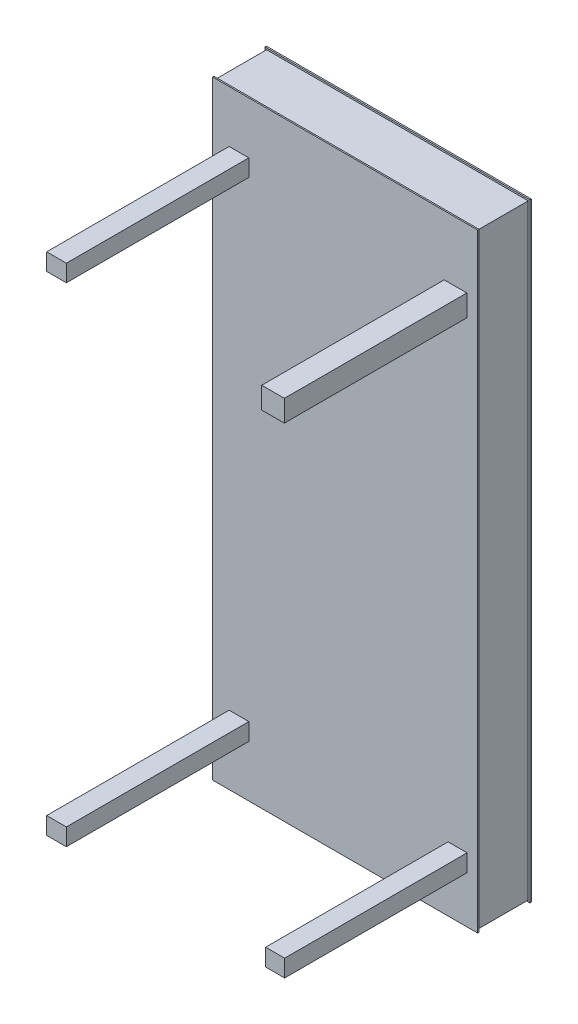
ISO-10303-21;
HEADER;
FILE_DESCRIPTION(('STEP AP214'),'2;1');
FILE_NAME('part.step','',(''),(''),'','','');
FILE_SCHEMA(('AUTOMOTIVE_DESIGN { 1 0 10303 214 1 1 1 1 }'));
ENDSEC;
DATA;
#1=APPLICATION_CONTEXT('core data for automotive mechanical design processes');
#2=APPLICATION_PROTOCOL_DEFINITION('international standard','automotive_design',2000,#1);
#3=PRODUCT_CONTEXT('',#1,'mechanical');
#4=PRODUCT('Part','Part','',(#3));
#5=PRODUCT_RELATED_PRODUCT_CATEGORY('part','',(#4));
#6=PRODUCT_DEFINITION_FORMATION('','',#4);
#7=PRODUCT_DEFINITION_CONTEXT('part definition',#1,'design');
#8=PRODUCT_DEFINITION('design','',#6,#7);
#9=PRODUCT_DEFINITION_SHAPE('','',#8);
#10=(LENGTH_UNIT() NAMED_UNIT(*) SI_UNIT(.MILLI.,.METRE.));
#11=(NAMED_UNIT(*) PLANE_ANGLE_UNIT() SI_UNIT($,.RADIAN.));
#12=(NAMED_UNIT(*) SI_UNIT($,.STERADIAN.) SOLID_ANGLE_UNIT());
#13=UNCERTAINTY_MEASURE_WITH_UNIT(LENGTH_MEASURE(1.E-05),#10,'distance_accuracy_value','');
#14=(GEOMETRIC_REPRESENTATION_CONTEXT(3) GLOBAL_UNCERTAINTY_ASSIGNED_CONTEXT((#13)) GLOBAL_UNIT_ASSIGNED_CONTEXT((#10,
#11,#12)) REPRESENTATION_CONTEXT('',''));
#15=CARTESIAN_POINT('',(0.,0.,0.));
#16=DIRECTION('',(0.,0.,1.));
#17=DIRECTION('',(1.,0.,0.));
#18=AXIS2_PLACEMENT_3D('',#15,#16,#17);
#19=CARTESIAN_POINT('',(304.974394134603,336.55533738051,50.8));
#20=DIRECTION('',(1.,0.,0.));
#21=DIRECTION('',(0.,1.,0.));
#22=AXIS2_PLACEMENT_3D('',#19,#20,#21);
#23=PLANE('',#22);
#24=DIRECTION('',(0.,0.,-1.));
#25=VECTOR('',#24,1.);
#26=CARTESIAN_POINT('',(304.974394134603,-1024.43660351407,50.8));
#27=LINE('',#26,#25);
#28=CARTESIAN_POINT('',(304.974394134603,-1024.43660351407,127.));
#29=VERTEX_POINT('',#28);
#30=CARTESIAN_POINT('',(304.974394134603,-1024.43660351407,123.892156102237));
#31=VERTEX_POINT('',#30);
#32=EDGE_CURVE('E339',#29,#31,#27,.T.);
#33=ORIENTED_EDGE('',*,*,#32,.T.);
#34=DIRECTION('',(0.,-1.,0.));
#35=VECTOR('',#34,1.);
#36=CARTESIAN_POINT('',(304.974394134603,416.55533738051,123.892156102237));
#37=LINE('',#36,#35);
#38=CARTESIAN_POINT('',(304.974394134603,416.55533738051,123.892156102237));
#39=VERTEX_POINT('',#38);
#40=EDGE_CURVE('E282',#39,#31,#37,.T.);
#41=ORIENTED_EDGE('',*,*,#40,.F.);
#42=DIRECTION('',(0.,0.,-1.));
#43=VECTOR('',#42,1.);
#44=CARTESIAN_POINT('',(304.974394134603,416.55533738051,50.8));
#45=LINE('',#44,#43);
#46=CARTESIAN_POINT('',(304.974394134603,416.55533738051,127.));
#47=VERTEX_POINT('',#46);
#48=EDGE_CURVE('E389',#47,#39,#45,.T.);
#49=ORIENTED_EDGE('',*,*,#48,.F.);
#50=DIRECTION('',(0.,-1.,0.));
#51=VECTOR('',#50,1.);
#52=CARTESIAN_POINT('',(304.974394134603,336.55533738051,127.));
#53=LINE('',#52,#51);
#54=EDGE_CURVE('E517',#47,#29,#53,.T.);
#55=ORIENTED_EDGE('',*,*,#54,.T.);
#56=EDGE_LOOP('',(#33,#41,#49,#55));
#57=FACE_BOUND('',#56,.T.);
#58=ADVANCED_FACE('F17',(#57),#23,.T.);
#59=CARTESIAN_POINT('',(-322.313815005856,-1024.43660351407,50.8));
#60=DIRECTION('',(0.,1.,0.));
#61=DIRECTION('',(1.,0.,0.));
#62=AXIS2_PLACEMENT_3D('',#59,#60,#61);
#63=PLANE('',#62);
#64=DIRECTION('',(-1.,0.,0.));
#65=VECTOR('',#64,1.);
#66=CARTESIAN_POINT('',(304.974394134603,-1024.43660351407,123.892156102237));
#67=LINE('',#66,#65);
#68=CARTESIAN_POINT('',(-322.313815005856,-1024.43660351407,123.892156102237));
#69=VERTEX_POINT('',#68);
#70=EDGE_CURVE('E313',#31,#69,#67,.T.);
#71=ORIENTED_EDGE('',*,*,#70,.F.);
#72=ORIENTED_EDGE('',*,*,#32,.F.);
#73=DIRECTION('',(1.,0.,0.));
#74=VECTOR('',#73,1.);
#75=CARTESIAN_POINT('',(0.,-1024.43660351407,127.));
#76=LINE('',#75,#74);
#77=CARTESIAN_POINT('',(-322.313815005856,-1024.43660351407,127.));
#78=VERTEX_POINT('',#77);
#79=EDGE_CURVE('E534',#78,#29,#76,.T.);
#80=ORIENTED_EDGE('',*,*,#79,.F.);
#81=DIRECTION('',(0.,0.,-1.));
#82=VECTOR('',#81,1.);
#83=CARTESIAN_POINT('',(-322.313815005856,-1024.43660351407,50.8));
#84=LINE('',#83,#82);
#85=EDGE_CURVE('E451',#78,#69,#84,.T.);
#86=ORIENTED_EDGE('',*,*,#85,.T.);
#87=EDGE_LOOP('',(#71,#72,#80,#86));
#88=FACE_BOUND('',#87,.T.);
#89=ADVANCED_FACE('F551',(#88),#63,.F.);
#90=CARTESIAN_POINT('',(-322.313815005856,336.55533738051,50.8));
#91=DIRECTION('',(1.,0.,0.));
#92=DIRECTION('',(0.,1.,0.));
#93=AXIS2_PLACEMENT_3D('',#90,#91,#92);
#94=PLANE('',#93);
#95=DIRECTION('',(0.,1.,0.));
#96=VECTOR('',#95,1.);
#97=CARTESIAN_POINT('',(-322.313815005855,-1024.43660351407,123.892156102237));
#98=LINE('',#97,#96);
#99=CARTESIAN_POINT('',(-322.313815005856,416.55533738051,123.892156102237));
#100=VERTEX_POINT('',#99);
#101=EDGE_CURVE('E250',#69,#100,#98,.T.);
#102=ORIENTED_EDGE('',*,*,#101,.F.);
#103=ORIENTED_EDGE('',*,*,#85,.F.);
#104=DIRECTION('',(0.,-1.,0.));
#105=VECTOR('',#104,1.);
#106=CARTESIAN_POINT('',(-322.313815005856,336.55533738051,127.));
#107=LINE('',#106,#105);
#108=CARTESIAN_POINT('',(-322.313815005856,416.55533738051,127.));
#109=VERTEX_POINT('',#108);
#110=EDGE_CURVE('E21',#109,#78,#107,.T.);
#111=ORIENTED_EDGE('',*,*,#110,.F.);
#112=DIRECTION('',(0.,0.,-1.));
#113=VECTOR('',#112,1.);
#114=CARTESIAN_POINT('',(-322.313815005856,416.55533738051,50.8));
#115=LINE('',#114,#113);
#116=EDGE_CURVE('E420',#109,#100,#115,.T.);
#117=ORIENTED_EDGE('',*,*,#116,.T.);
#118=EDGE_LOOP('',(#102,#103,#111,#117));
#119=FACE_BOUND('',#118,.T.);
#120=ADVANCED_FACE('F548',(#119),#94,.F.);
#121=CARTESIAN_POINT('',(-322.313815005856,416.55533738051,50.8));
#122=DIRECTION('',(0.,1.,0.));
#123=DIRECTION('',(1.,0.,0.));
#124=AXIS2_PLACEMENT_3D('',#121,#122,#123);
#125=PLANE('',#124);
#126=ORIENTED_EDGE('',*,*,#48,.T.);
#127=DIRECTION('',(1.,0.,0.));
#128=VECTOR('',#127,1.);
#129=CARTESIAN_POINT('',(-322.313815005856,416.55533738051,123.892156102237));
#130=LINE('',#129,#128);
#131=EDGE_CURVE('E276',#100,#39,#130,.T.);
#132=ORIENTED_EDGE('',*,*,#131,.F.);
#133=ORIENTED_EDGE('',*,*,#116,.F.);
#134=DIRECTION('',(1.,0.,0.));
#135=VECTOR('',#134,1.);
#136=CARTESIAN_POINT('',(0.,416.55533738051,127.));
#137=LINE('',#136,#135);
#138=EDGE_CURVE('E528',#109,#47,#137,.T.);
#139=ORIENTED_EDGE('',*,*,#138,.T.);
#140=EDGE_LOOP('',(#126,#132,#133,#139));
#141=FACE_BOUND('',#140,.T.);
#142=ADVANCED_FACE('F555',(#141),#125,.T.);
#143=CARTESIAN_POINT('',(0.,0.,558.8));
#144=DIRECTION('',(0.,0.,-1.));
#145=DIRECTION('',(0.,-1.,0.));
#146=AXIS2_PLACEMENT_3D('',#143,#144,#145);
#147=PLANE('',#146);
#148=DIRECTION('',(0.,-1.,0.));
#149=VECTOR('',#148,1.);
#150=CARTESIAN_POINT('',(234.901534449023,-313.011058638893,558.8));
#151=LINE('',#150,#149);
#152=CARTESIAN_POINT('',(234.901534449023,-872.350237807336,558.8));
#153=VERTEX_POINT('',#152);
#154=CARTESIAN_POINT('',(234.901534449023,-913.011058638892,558.8));
#155=VERTEX_POINT('',#154);
#156=EDGE_CURVE('E328',#153,#155,#151,.T.);
#157=ORIENTED_EDGE('',*,*,#156,.T.);
#158=DIRECTION('',(1.,0.,0.));
#159=VECTOR('',#158,1.);
#160=CARTESIAN_POINT('',(234.901534449023,-913.011058638892,558.8));
#161=LINE('',#160,#159);
#162=CARTESIAN_POINT('',(279.904084855988,-913.011058638892,558.8));
#163=VERTEX_POINT('',#162);
#164=EDGE_CURVE('E425',#155,#163,#161,.T.);
#165=ORIENTED_EDGE('',*,*,#164,.T.);
#166=DIRECTION('',(0.,1.,0.));
#167=VECTOR('',#166,1.);
#168=CARTESIAN_POINT('',(279.904084855988,-313.011058638893,558.8));
#169=LINE('',#168,#167);
#170=CARTESIAN_POINT('',(279.904084855988,-872.350237807336,558.8));
#171=VERTEX_POINT('',#170);
#172=EDGE_CURVE('E27',#163,#171,#169,.T.);
#173=ORIENTED_EDGE('',*,*,#172,.T.);
#174=DIRECTION('',(-1.,0.,0.));
#175=VECTOR('',#174,1.);
#176=CARTESIAN_POINT('',(234.901534449023,-872.350237807336,558.8));
#177=LINE('',#176,#175);
#178=EDGE_CURVE('E11',#171,#153,#177,.T.);
#179=ORIENTED_EDGE('',*,*,#178,.T.);
#180=EDGE_LOOP('',(#157,#165,#173,#179));
#181=FACE_BOUND('',#180,.T.);
#182=ADVANCED_FACE('F697',(#181),#147,.F.);
#183=CARTESIAN_POINT('',(234.901534449023,-872.350237807336,558.8));
#184=DIRECTION('',(0.,-1.,0.));
#185=DIRECTION('',(0.,0.,-1.));
#186=AXIS2_PLACEMENT_3D('',#183,#184,#185);
#187=PLANE('',#186);
#188=DIRECTION('',(-1.,0.,0.));
#189=VECTOR('',#188,1.);
#190=CARTESIAN_POINT('',(234.901534449023,-872.350237807336,127.));
#191=LINE('',#190,#189);
#192=CARTESIAN_POINT('',(279.904084855988,-872.350237807336,127.));
#193=VERTEX_POINT('',#192);
#194=CARTESIAN_POINT('',(234.901534449023,-872.350237807336,127.));
#195=VERTEX_POINT('',#194);
#196=EDGE_CURVE('E468',#193,#195,#191,.T.);
#197=ORIENTED_EDGE('',*,*,#196,.T.);
#198=DIRECTION('',(0.,0.,-1.));
#199=VECTOR('',#198,1.);
#200=CARTESIAN_POINT('',(234.901534449023,-872.350237807336,558.8));
#201=LINE('',#200,#199);
#202=EDGE_CURVE('E332',#153,#195,#201,.T.);
#203=ORIENTED_EDGE('',*,*,#202,.F.);
#204=ORIENTED_EDGE('',*,*,#178,.F.);
#205=DIRECTION('',(0.,0.,-1.));
#206=VECTOR('',#205,1.);
#207=CARTESIAN_POINT('',(279.904084855988,-872.350237807336,558.8));
#208=LINE('',#207,#206);
#209=EDGE_CURVE('E352',#171,#193,#208,.T.);
#210=ORIENTED_EDGE('',*,*,#209,.T.);
#211=EDGE_LOOP('',(#197,#203,#204,#210));
#212=FACE_BOUND('',#211,.T.);
#213=ADVANCED_FACE('F678',(#212),#187,.F.);
#214=CARTESIAN_POINT('',(279.904084855988,-313.011058638893,558.8));
#215=DIRECTION('',(-1.,0.,0.));
#216=DIRECTION('',(0.,0.,1.));
#217=AXIS2_PLACEMENT_3D('',#214,#215,#216);
#218=PLANE('',#217);
#219=DIRECTION('',(0.,1.,0.));
#220=VECTOR('',#219,1.);
#221=CARTESIAN_POINT('',(279.904084855988,-313.011058638893,127.));
#222=LINE('',#221,#220);
#223=CARTESIAN_POINT('',(279.904084855988,-913.011058638892,127.));
#224=VERTEX_POINT('',#223);
#225=EDGE_CURVE('E473',#224,#193,#222,.T.);
#226=ORIENTED_EDGE('',*,*,#225,.T.);
#227=ORIENTED_EDGE('',*,*,#209,.F.);
#228=ORIENTED_EDGE('',*,*,#172,.F.);
#229=DIRECTION('',(0.,0.,-1.));
#230=VECTOR('',#229,1.);
#231=CARTESIAN_POINT('',(279.904084855988,-913.011058638892,558.8));
#232=LINE('',#231,#230);
#233=EDGE_CURVE('E429',#163,#224,#232,.T.);
#234=ORIENTED_EDGE('',*,*,#233,.T.);
#235=EDGE_LOOP('',(#226,#227,#228,#234));
#236=FACE_BOUND('',#235,.T.);
#237=ADVANCED_FACE('F621',(#236),#218,.F.);
#238=CARTESIAN_POINT('',(234.901534449023,-913.011058638892,558.8));
#239=DIRECTION('',(0.,1.,0.));
#240=DIRECTION('',(1.,0.,0.));
#241=AXIS2_PLACEMENT_3D('',#238,#239,#240);
#242=PLANE('',#241);
#243=DIRECTION('',(1.,0.,0.));
#244=VECTOR('',#243,1.);
#245=CARTESIAN_POINT('',(234.901534449023,-913.011058638892,127.));
#246=LINE('',#245,#244);
#247=CARTESIAN_POINT('',(234.901534449023,-913.011058638892,127.));
#248=VERTEX_POINT('',#247);
#249=EDGE_CURVE('E415',#248,#224,#246,.T.);
#250=ORIENTED_EDGE('',*,*,#249,.T.);
#251=ORIENTED_EDGE('',*,*,#233,.F.);
#252=ORIENTED_EDGE('',*,*,#164,.F.);
#253=DIRECTION('',(0.,0.,-1.));
#254=VECTOR('',#253,1.);
#255=CARTESIAN_POINT('',(234.901534449023,-913.011058638892,558.8));
#256=LINE('',#255,#254);
#257=EDGE_CURVE('E333',#155,#248,#256,.T.);
#258=ORIENTED_EDGE('',*,*,#257,.T.);
#259=EDGE_LOOP('',(#250,#251,#252,#258));
#260=FACE_BOUND('',#259,.T.);
#261=ADVANCED_FACE('F618',(#260),#242,.F.);
#262=CARTESIAN_POINT('',(234.901534449023,-313.011058638893,558.8));
#263=DIRECTION('',(1.,0.,0.));
#264=DIRECTION('',(0.,1.,0.));
#265=AXIS2_PLACEMENT_3D('',#262,#263,#264);
#266=PLANE('',#265);
#267=DIRECTION('',(0.,-1.,0.));
#268=VECTOR('',#267,1.);
#269=CARTESIAN_POINT('',(234.901534449023,-313.011058638893,127.));
#270=LINE('',#269,#268);
#271=EDGE_CURVE('E464',#195,#248,#270,.T.);
#272=ORIENTED_EDGE('',*,*,#271,.T.);
#273=ORIENTED_EDGE('',*,*,#257,.F.);
#274=ORIENTED_EDGE('',*,*,#156,.F.);
#275=ORIENTED_EDGE('',*,*,#202,.T.);
#276=EDGE_LOOP('',(#272,#273,#274,#275));
#277=FACE_BOUND('',#276,.T.);
#278=ADVANCED_FACE('F620',(#277),#266,.F.);
#279=CARTESIAN_POINT('',(0.,0.,558.8));
#280=DIRECTION('',(0.,0.,-1.));
#281=DIRECTION('',(0.,-1.,0.));
#282=AXIS2_PLACEMENT_3D('',#279,#280,#281);
#283=PLANE('',#282);
#284=DIRECTION('',(0.,-1.,0.));
#285=VECTOR('',#284,1.);
#286=CARTESIAN_POINT('',(225.665674265971,223.790982909799,558.8));
#287=LINE('',#286,#285);
#288=CARTESIAN_POINT('',(225.665674265971,274.701015858194,558.8));
#289=VERTEX_POINT('',#288);
#290=CARTESIAN_POINT('',(225.665674265971,223.790982909799,558.8));
#291=VERTEX_POINT('',#290);
#292=EDGE_CURVE('E348',#289,#291,#287,.T.);
#293=ORIENTED_EDGE('',*,*,#292,.T.);
#294=DIRECTION('',(1.,0.,0.));
#295=VECTOR('',#294,1.);
#296=CARTESIAN_POINT('',(225.665674265971,223.790982909799,558.8));
#297=LINE('',#296,#295);
#298=CARTESIAN_POINT('',(279.261201124231,223.790982909799,558.8));
#299=VERTEX_POINT('',#298);
#300=EDGE_CURVE('E326',#291,#299,#297,.T.);
#301=ORIENTED_EDGE('',*,*,#300,.T.);
#302=DIRECTION('',(0.,1.,0.));
#303=VECTOR('',#302,1.);
#304=CARTESIAN_POINT('',(279.261201124231,223.790982909799,558.8));
#305=LINE('',#304,#303);
#306=CARTESIAN_POINT('',(279.261201124231,274.701015858194,558.8));
#307=VERTEX_POINT('',#306);
#308=EDGE_CURVE('E340',#299,#307,#305,.T.);
#309=ORIENTED_EDGE('',*,*,#308,.T.);
#310=DIRECTION('',(-1.,0.,0.));
#311=VECTOR('',#310,1.);
#312=CARTESIAN_POINT('',(225.665674265971,274.701015858194,558.8));
#313=LINE('',#312,#311);
#314=EDGE_CURVE('E344',#307,#289,#313,.T.);
#315=ORIENTED_EDGE('',*,*,#314,.T.);
#316=EDGE_LOOP('',(#293,#301,#309,#315));
#317=FACE_BOUND('',#316,.T.);
#318=ADVANCED_FACE('F686',(#317),#283,.F.);
#319=CARTESIAN_POINT('',(225.665674265971,274.701015858194,558.8));
#320=DIRECTION('',(0.,-1.,0.));
#321=DIRECTION('',(0.,0.,-1.));
#322=AXIS2_PLACEMENT_3D('',#319,#320,#321);
#323=PLANE('',#322);
#324=DIRECTION('',(-1.,0.,0.));
#325=VECTOR('',#324,1.);
#326=CARTESIAN_POINT('',(225.665674265971,274.701015858194,127.));
#327=LINE('',#326,#325);
#328=CARTESIAN_POINT('',(279.261201124231,274.701015858194,127.));
#329=VERTEX_POINT('',#328);
#330=CARTESIAN_POINT('',(225.665674265971,274.701015858194,127.));
#331=VERTEX_POINT('',#330);
#332=EDGE_CURVE('E516',#329,#331,#327,.T.);
#333=ORIENTED_EDGE('',*,*,#332,.T.);
#334=DIRECTION('',(0.,0.,-1.));
#335=VECTOR('',#334,1.);
#336=CARTESIAN_POINT('',(225.665674265971,274.701015858194,558.8));
#337=LINE('',#336,#335);
#338=EDGE_CURVE('E327',#289,#331,#337,.T.);
#339=ORIENTED_EDGE('',*,*,#338,.F.);
#340=ORIENTED_EDGE('',*,*,#314,.F.);
#341=DIRECTION('',(0.,0.,-1.));
#342=VECTOR('',#341,1.);
#343=CARTESIAN_POINT('',(279.261201124231,274.701015858194,558.8));
#344=LINE('',#343,#342);
#345=EDGE_CURVE('E345',#307,#329,#344,.T.);
#346=ORIENTED_EDGE('',*,*,#345,.T.);
#347=EDGE_LOOP('',(#333,#339,#340,#346));
#348=FACE_BOUND('',#347,.T.);
#349=ADVANCED_FACE('F670',(#348),#323,.F.);
#350=CARTESIAN_POINT('',(279.261201124231,223.790982909799,558.8));
#351=DIRECTION('',(-1.,0.,0.));
#352=DIRECTION('',(0.,0.,1.));
#353=AXIS2_PLACEMENT_3D('',#350,#351,#352);
#354=PLANE('',#353);
#355=DIRECTION('',(0.,1.,0.));
#356=VECTOR('',#355,1.);
#357=CARTESIAN_POINT('',(279.261201124231,223.790982909799,127.));
#358=LINE('',#357,#356);
#359=CARTESIAN_POINT('',(279.261201124231,223.790982909799,127.));
#360=VERTEX_POINT('',#359);
#361=EDGE_CURVE('E521',#360,#329,#358,.T.);
#362=ORIENTED_EDGE('',*,*,#361,.T.);
#363=ORIENTED_EDGE('',*,*,#345,.F.);
#364=ORIENTED_EDGE('',*,*,#308,.F.);
#365=DIRECTION('',(0.,0.,-1.));
#366=VECTOR('',#365,1.);
#367=CARTESIAN_POINT('',(279.261201124231,223.790982909799,558.8));
#368=LINE('',#367,#366);
#369=EDGE_CURVE('E323',#299,#360,#368,.T.);
#370=ORIENTED_EDGE('',*,*,#369,.T.);
#371=EDGE_LOOP('',(#362,#363,#364,#370));
#372=FACE_BOUND('',#371,.T.);
#373=ADVANCED_FACE('F666',(#372),#354,.F.);
#374=CARTESIAN_POINT('',(225.665674265971,223.790982909799,558.8));
#375=DIRECTION('',(0.,1.,0.));
#376=DIRECTION('',(1.,0.,0.));
#377=AXIS2_PLACEMENT_3D('',#374,#375,#376);
#378=PLANE('',#377);
#379=DIRECTION('',(1.,0.,0.));
#380=VECTOR('',#379,1.);
#381=CARTESIAN_POINT('',(225.665674265971,223.790982909799,127.));
#382=LINE('',#381,#380);
#383=CARTESIAN_POINT('',(225.665674265971,223.790982909799,127.));
#384=VERTEX_POINT('',#383);
#385=EDGE_CURVE('E501',#384,#360,#382,.T.);
#386=ORIENTED_EDGE('',*,*,#385,.T.);
#387=ORIENTED_EDGE('',*,*,#369,.F.);
#388=ORIENTED_EDGE('',*,*,#300,.F.);
#389=DIRECTION('',(0.,0.,-1.));
#390=VECTOR('',#389,1.);
#391=CARTESIAN_POINT('',(225.665674265971,223.790982909799,558.8));
#392=LINE('',#391,#390);
#393=EDGE_CURVE('E372',#291,#384,#392,.T.);
#394=ORIENTED_EDGE('',*,*,#393,.T.);
#395=EDGE_LOOP('',(#386,#387,#388,#394));
#396=FACE_BOUND('',#395,.T.);
#397=ADVANCED_FACE('F669',(#396),#378,.F.);
#398=CARTESIAN_POINT('',(225.665674265971,223.790982909799,558.8));
#399=DIRECTION('',(1.,0.,0.));
#400=DIRECTION('',(0.,1.,0.));
#401=AXIS2_PLACEMENT_3D('',#398,#399,#400);
#402=PLANE('',#401);
#403=DIRECTION('',(0.,-1.,0.));
#404=VECTOR('',#403,1.);
#405=CARTESIAN_POINT('',(225.665674265971,223.790982909799,127.));
#406=LINE('',#405,#404);
#407=EDGE_CURVE('E512',#331,#384,#406,.T.);
#408=ORIENTED_EDGE('',*,*,#407,.T.);
#409=ORIENTED_EDGE('',*,*,#393,.F.);
#410=ORIENTED_EDGE('',*,*,#292,.F.);
#411=ORIENTED_EDGE('',*,*,#338,.T.);
#412=EDGE_LOOP('',(#408,#409,#410,#411));
#413=FACE_BOUND('',#412,.T.);
#414=ADVANCED_FACE('F684',(#413),#402,.F.);
#415=CARTESIAN_POINT('',(0.,0.,558.8));
#416=DIRECTION('',(0.,0.,-1.));
#417=DIRECTION('',(0.,-1.,0.));
#418=AXIS2_PLACEMENT_3D('',#415,#416,#417);
#419=PLANE('',#418);
#420=DIRECTION('',(0.,-1.,0.));
#421=VECTOR('',#420,1.);
#422=CARTESIAN_POINT('',(-283.305539452013,253.426544065627,558.8));
#423=LINE('',#422,#421);
#424=CARTESIAN_POINT('',(-283.305539452013,293.656463184442,558.8));
#425=VERTEX_POINT('',#424);
#426=CARTESIAN_POINT('',(-283.305539452013,253.426544065627,558.8));
#427=VERTEX_POINT('',#426);
#428=EDGE_CURVE('E356',#425,#427,#423,.T.);
#429=ORIENTED_EDGE('',*,*,#428,.T.);
#430=DIRECTION('',(1.,0.,0.));
#431=VECTOR('',#430,1.);
#432=CARTESIAN_POINT('',(-283.305539452013,253.426544065627,558.8));
#433=LINE('',#432,#431);
#434=CARTESIAN_POINT('',(-236.677575327773,253.426544065627,558.8));
#435=VERTEX_POINT('',#434);
#436=EDGE_CURVE('E366',#427,#435,#433,.T.);
#437=ORIENTED_EDGE('',*,*,#436,.T.);
#438=DIRECTION('',(0.,1.,0.));
#439=VECTOR('',#438,1.);
#440=CARTESIAN_POINT('',(-236.677575327773,253.426544065627,558.8));
#441=LINE('',#440,#439);
#442=CARTESIAN_POINT('',(-236.677575327773,293.656463184442,558.8));
#443=VERTEX_POINT('',#442);
#444=EDGE_CURVE('E383',#435,#443,#441,.T.);
#445=ORIENTED_EDGE('',*,*,#444,.T.);
#446=DIRECTION('',(-1.,0.,0.));
#447=VECTOR('',#446,1.);
#448=CARTESIAN_POINT('',(-283.305539452013,293.656463184442,558.8));
#449=LINE('',#448,#447);
#450=EDGE_CURVE('E375',#443,#425,#449,.T.);
#451=ORIENTED_EDGE('',*,*,#450,.T.);
#452=EDGE_LOOP('',(#429,#437,#445,#451));
#453=FACE_BOUND('',#452,.T.);
#454=ADVANCED_FACE('F681',(#453),#419,.F.);
#455=CARTESIAN_POINT('',(-283.305539452013,293.656463184442,558.8));
#456=DIRECTION('',(0.,-1.,0.));
#457=DIRECTION('',(0.,0.,-1.));
#458=AXIS2_PLACEMENT_3D('',#455,#456,#457);
#459=PLANE('',#458);
#460=DIRECTION('',(-1.,0.,0.));
#461=VECTOR('',#460,1.);
#462=CARTESIAN_POINT('',(-283.305539452013,293.656463184442,127.));
#463=LINE('',#462,#461);
#464=CARTESIAN_POINT('',(-236.677575327773,293.656463184442,127.));
#465=VERTEX_POINT('',#464);
#466=CARTESIAN_POINT('',(-283.305539452013,293.656463184442,127.));
#467=VERTEX_POINT('',#466);
#468=EDGE_CURVE('E484',#465,#467,#463,.T.);
#469=ORIENTED_EDGE('',*,*,#468,.T.);
#470=DIRECTION('',(0.,0.,-1.));
#471=VECTOR('',#470,1.);
#472=CARTESIAN_POINT('',(-283.305539452013,293.656463184442,558.8));
#473=LINE('',#472,#471);
#474=EDGE_CURVE('E396',#425,#467,#473,.T.);
#475=ORIENTED_EDGE('',*,*,#474,.F.);
#476=ORIENTED_EDGE('',*,*,#450,.F.);
#477=DIRECTION('',(0.,0.,-1.));
#478=VECTOR('',#477,1.);
#479=CARTESIAN_POINT('',(-236.677575327773,293.656463184442,558.8));
#480=LINE('',#479,#478);
#481=EDGE_CURVE('E370',#443,#465,#480,.T.);
#482=ORIENTED_EDGE('',*,*,#481,.T.);
#483=EDGE_LOOP('',(#469,#475,#476,#482));
#484=FACE_BOUND('',#483,.T.);
#485=ADVANCED_FACE('F675',(#484),#459,.F.);
#486=CARTESIAN_POINT('',(-236.677575327773,253.426544065627,558.8));
#487=DIRECTION('',(-1.,0.,0.));
#488=DIRECTION('',(0.,0.,1.));
#489=AXIS2_PLACEMENT_3D('',#486,#487,#488);
#490=PLANE('',#489);
#491=DIRECTION('',(0.,1.,0.));
#492=VECTOR('',#491,1.);
#493=CARTESIAN_POINT('',(-236.677575327773,253.426544065627,127.));
#494=LINE('',#493,#492);
#495=CARTESIAN_POINT('',(-236.677575327773,253.426544065627,127.));
#496=VERTEX_POINT('',#495);
#497=EDGE_CURVE('E489',#496,#465,#494,.T.);
#498=ORIENTED_EDGE('',*,*,#497,.T.);
#499=ORIENTED_EDGE('',*,*,#481,.F.);
#500=ORIENTED_EDGE('',*,*,#444,.F.);
#501=DIRECTION('',(0.,0.,-1.));
#502=VECTOR('',#501,1.);
#503=CARTESIAN_POINT('',(-236.677575327773,253.426544065627,558.8));
#504=LINE('',#503,#502);
#505=EDGE_CURVE('E371',#435,#496,#504,.T.);
#506=ORIENTED_EDGE('',*,*,#505,.T.);
#507=EDGE_LOOP('',(#498,#499,#500,#506));
#508=FACE_BOUND('',#507,.T.);
#509=ADVANCED_FACE('F672',(#508),#490,.F.);
#510=CARTESIAN_POINT('',(-283.305539452013,253.426544065627,558.8));
#511=DIRECTION('',(0.,1.,0.));
#512=DIRECTION('',(1.,0.,0.));
#513=AXIS2_PLACEMENT_3D('',#510,#511,#512);
#514=PLANE('',#513);
#515=DIRECTION('',(1.,0.,0.));
#516=VECTOR('',#515,1.);
#517=CARTESIAN_POINT('',(-283.305539452013,253.426544065627,127.));
#518=LINE('',#517,#516);
#519=CARTESIAN_POINT('',(-283.305539452013,253.426544065627,127.));
#520=VERTEX_POINT('',#519);
#521=EDGE_CURVE('E469',#520,#496,#518,.T.);
#522=ORIENTED_EDGE('',*,*,#521,.T.);
#523=ORIENTED_EDGE('',*,*,#505,.F.);
#524=ORIENTED_EDGE('',*,*,#436,.F.);
#525=DIRECTION('',(0.,0.,-1.));
#526=VECTOR('',#525,1.);
#527=CARTESIAN_POINT('',(-283.305539452013,253.426544065627,558.8));
#528=LINE('',#527,#526);
#529=EDGE_CURVE('E353',#427,#520,#528,.T.);
#530=ORIENTED_EDGE('',*,*,#529,.T.);
#531=EDGE_LOOP('',(#522,#523,#524,#530));
#532=FACE_BOUND('',#531,.T.);
#533=ADVANCED_FACE('F662',(#532),#514,.F.);
#534=CARTESIAN_POINT('',(-283.305539452013,253.426544065627,558.8));
#535=DIRECTION('',(1.,0.,0.));
#536=DIRECTION('',(0.,1.,0.));
#537=AXIS2_PLACEMENT_3D('',#534,#535,#536);
#538=PLANE('',#537);
#539=DIRECTION('',(0.,-1.,0.));
#540=VECTOR('',#539,1.);
#541=CARTESIAN_POINT('',(-283.305539452013,253.426544065627,127.));
#542=LINE('',#541,#540);
#543=EDGE_CURVE('E480',#467,#520,#542,.T.);
#544=ORIENTED_EDGE('',*,*,#543,.T.);
#545=ORIENTED_EDGE('',*,*,#529,.F.);
#546=ORIENTED_EDGE('',*,*,#428,.F.);
#547=ORIENTED_EDGE('',*,*,#474,.T.);
#548=EDGE_LOOP('',(#544,#545,#546,#547));
#549=FACE_BOUND('',#548,.T.);
#550=ADVANCED_FACE('F657',(#549),#538,.F.);
#551=CARTESIAN_POINT('',(0.,0.,558.8));
#552=DIRECTION('',(0.,0.,-1.));
#553=DIRECTION('',(0.,-1.,0.));
#554=AXIS2_PLACEMENT_3D('',#551,#552,#553);
#555=PLANE('',#554);
#556=DIRECTION('',(0.,-1.,0.));
#557=VECTOR('',#556,1.);
#558=CARTESIAN_POINT('',(-283.305539452013,-302.378201449022,558.8));
#559=LINE('',#558,#557);
#560=CARTESIAN_POINT('',(-283.305539452013,-861.694046409778,558.8));
#561=VERTEX_POINT('',#560);
#562=CARTESIAN_POINT('',(-283.305539452013,-902.378201449022,558.8));
#563=VERTEX_POINT('',#562);
#564=EDGE_CURVE('E376',#561,#563,#559,.T.);
#565=ORIENTED_EDGE('',*,*,#564,.T.);
#566=DIRECTION('',(1.,0.,0.));
#567=VECTOR('',#566,1.);
#568=CARTESIAN_POINT('',(-283.305539452013,-902.378201449022,558.8));
#569=LINE('',#568,#567);
#570=CARTESIAN_POINT('',(-236.677575327773,-902.378201449022,558.8));
#571=VERTEX_POINT('',#570);
#572=EDGE_CURVE('E432',#563,#571,#569,.T.);
#573=ORIENTED_EDGE('',*,*,#572,.T.);
#574=DIRECTION('',(0.,1.,0.));
#575=VECTOR('',#574,1.);
#576=CARTESIAN_POINT('',(-236.677575327773,-302.378201449022,558.8));
#577=LINE('',#576,#575);
#578=CARTESIAN_POINT('',(-236.677575327773,-861.694046409778,558.8));
#579=VERTEX_POINT('',#578);
#580=EDGE_CURVE('E358',#571,#579,#577,.T.);
#581=ORIENTED_EDGE('',*,*,#580,.T.);
#582=DIRECTION('',(-1.,0.,0.));
#583=VECTOR('',#582,1.);
#584=CARTESIAN_POINT('',(-283.305539452013,-861.694046409778,558.8));
#585=LINE('',#584,#583);
#586=EDGE_CURVE('E357',#579,#561,#585,.T.);
#587=ORIENTED_EDGE('',*,*,#586,.T.);
#588=EDGE_LOOP('',(#565,#573,#581,#587));
#589=FACE_BOUND('',#588,.T.);
#590=ADVANCED_FACE('F648',(#589),#555,.F.);
#591=CARTESIAN_POINT('',(-283.305539452013,-861.694046409778,558.8));
#592=DIRECTION('',(0.,-1.,0.));
#593=DIRECTION('',(0.,0.,-1.));
#594=AXIS2_PLACEMENT_3D('',#591,#592,#593);
#595=PLANE('',#594);
#596=DIRECTION('',(-1.,0.,0.));
#597=VECTOR('',#596,1.);
#598=CARTESIAN_POINT('',(-283.305539452013,-861.694046409778,127.));
#599=LINE('',#598,#597);
#600=CARTESIAN_POINT('',(-236.677575327773,-861.694046409778,127.));
#601=VERTEX_POINT('',#600);
#602=CARTESIAN_POINT('',(-283.305539452013,-861.694046409778,127.));
#603=VERTEX_POINT('',#602);
#604=EDGE_CURVE('E500',#601,#603,#599,.T.);
#605=ORIENTED_EDGE('',*,*,#604,.T.);
#606=DIRECTION('',(0.,0.,-1.));
#607=VECTOR('',#606,1.);
#608=CARTESIAN_POINT('',(-283.305539452013,-861.694046409778,558.8));
#609=LINE('',#608,#607);
#610=EDGE_CURVE('E380',#561,#603,#609,.T.);
#611=ORIENTED_EDGE('',*,*,#610,.F.);
#612=ORIENTED_EDGE('',*,*,#586,.F.);
#613=DIRECTION('',(0.,0.,-1.));
#614=VECTOR('',#613,1.);
#615=CARTESIAN_POINT('',(-236.677575327773,-861.694046409778,558.8));
#616=LINE('',#615,#614);
#617=EDGE_CURVE('E362',#579,#601,#616,.T.);
#618=ORIENTED_EDGE('',*,*,#617,.T.);
#619=EDGE_LOOP('',(#605,#611,#612,#618));
#620=FACE_BOUND('',#619,.T.);
#621=ADVANCED_FACE('F616',(#620),#595,.F.);
#622=CARTESIAN_POINT('',(-236.677575327773,-302.378201449022,558.8));
#623=DIRECTION('',(-1.,0.,0.));
#624=DIRECTION('',(0.,0.,1.));
#625=AXIS2_PLACEMENT_3D('',#622,#623,#624);
#626=PLANE('',#625);
#627=DIRECTION('',(0.,1.,0.));
#628=VECTOR('',#627,1.);
#629=CARTESIAN_POINT('',(-236.677575327773,-302.378201449022,127.));
#630=LINE('',#629,#628);
#631=CARTESIAN_POINT('',(-236.677575327773,-902.378201449022,127.));
#632=VERTEX_POINT('',#631);
#633=EDGE_CURVE('E505',#632,#601,#630,.T.);
#634=ORIENTED_EDGE('',*,*,#633,.T.);
#635=ORIENTED_EDGE('',*,*,#617,.F.);
#636=ORIENTED_EDGE('',*,*,#580,.F.);
#637=DIRECTION('',(0.,0.,-1.));
#638=VECTOR('',#637,1.);
#639=CARTESIAN_POINT('',(-236.677575327773,-902.378201449022,558.8));
#640=LINE('',#639,#638);
#641=EDGE_CURVE('E436',#571,#632,#640,.T.);
#642=ORIENTED_EDGE('',*,*,#641,.T.);
#643=EDGE_LOOP('',(#634,#635,#636,#642));
#644=FACE_BOUND('',#643,.T.);
#645=ADVANCED_FACE('F626',(#644),#626,.F.);
#646=CARTESIAN_POINT('',(-283.305539452013,-902.378201449022,558.8));
#647=DIRECTION('',(0.,1.,0.));
#648=DIRECTION('',(1.,0.,0.));
#649=AXIS2_PLACEMENT_3D('',#646,#647,#648);
#650=PLANE('',#649);
#651=DIRECTION('',(1.,0.,0.));
#652=VECTOR('',#651,1.);
#653=CARTESIAN_POINT('',(-283.305539452013,-902.378201449022,127.));
#654=LINE('',#653,#652);
#655=CARTESIAN_POINT('',(-283.305539452013,-902.378201449022,127.));
#656=VERTEX_POINT('',#655);
#657=EDGE_CURVE('E485',#656,#632,#654,.T.);
#658=ORIENTED_EDGE('',*,*,#657,.T.);
#659=ORIENTED_EDGE('',*,*,#641,.F.);
#660=ORIENTED_EDGE('',*,*,#572,.F.);
#661=DIRECTION('',(0.,0.,-1.));
#662=VECTOR('',#661,1.);
#663=CARTESIAN_POINT('',(-283.305539452013,-902.378201449022,558.8));
#664=LINE('',#663,#662);
#665=EDGE_CURVE('E338',#563,#656,#664,.T.);
#666=ORIENTED_EDGE('',*,*,#665,.T.);
#667=EDGE_LOOP('',(#658,#659,#660,#666));
#668=FACE_BOUND('',#667,.T.);
#669=ADVANCED_FACE('F623',(#668),#650,.F.);
#670=CARTESIAN_POINT('',(-283.305539452013,-302.378201449022,558.8));
#671=DIRECTION('',(1.,0.,0.));
#672=DIRECTION('',(0.,1.,0.));
#673=AXIS2_PLACEMENT_3D('',#670,#671,#672);
#674=PLANE('',#673);
#675=DIRECTION('',(0.,-1.,0.));
#676=VECTOR('',#675,1.);
#677=CARTESIAN_POINT('',(-283.305539452013,-302.378201449022,127.));
#678=LINE('',#677,#676);
#679=EDGE_CURVE('E496',#603,#656,#678,.T.);
#680=ORIENTED_EDGE('',*,*,#679,.T.);
#681=ORIENTED_EDGE('',*,*,#665,.F.);
#682=ORIENTED_EDGE('',*,*,#564,.F.);
#683=ORIENTED_EDGE('',*,*,#610,.T.);
#684=EDGE_LOOP('',(#680,#681,#682,#683));
#685=FACE_BOUND('',#684,.T.);
#686=ADVANCED_FACE('F625',(#685),#674,.F.);
#687=CARTESIAN_POINT('',(0.,0.,127.));
#688=DIRECTION('',(0.,0.,-1.));
#689=DIRECTION('',(0.,-1.,0.));
#690=AXIS2_PLACEMENT_3D('',#687,#688,#689);
#691=PLANE('',#690);
#692=ORIENTED_EDGE('',*,*,#271,.F.);
#693=ORIENTED_EDGE('',*,*,#196,.F.);
#694=ORIENTED_EDGE('',*,*,#225,.F.);
#695=ORIENTED_EDGE('',*,*,#249,.F.);
#696=EDGE_LOOP('',(#692,#693,#694,#695));
#697=FACE_BOUND('',#696,.T.);
#698=ORIENTED_EDGE('',*,*,#543,.F.);
#699=ORIENTED_EDGE('',*,*,#468,.F.);
#700=ORIENTED_EDGE('',*,*,#497,.F.);
#701=ORIENTED_EDGE('',*,*,#521,.F.);
#702=EDGE_LOOP('',(#698,#699,#700,#701));
#703=FACE_BOUND('',#702,.T.);
#704=ORIENTED_EDGE('',*,*,#679,.F.);
#705=ORIENTED_EDGE('',*,*,#604,.F.);
#706=ORIENTED_EDGE('',*,*,#633,.F.);
#707=ORIENTED_EDGE('',*,*,#657,.F.);
#708=EDGE_LOOP('',(#704,#705,#706,#707));
#709=FACE_BOUND('',#708,.T.);
#710=ORIENTED_EDGE('',*,*,#407,.F.);
#711=ORIENTED_EDGE('',*,*,#332,.F.);
#712=ORIENTED_EDGE('',*,*,#361,.F.);
#713=ORIENTED_EDGE('',*,*,#385,.F.);
#714=EDGE_LOOP('',(#710,#711,#712,#713));
#715=FACE_BOUND('',#714,.T.);
#716=ORIENTED_EDGE('',*,*,#138,.F.);
#717=ORIENTED_EDGE('',*,*,#110,.T.);
#718=ORIENTED_EDGE('',*,*,#79,.T.);
#719=ORIENTED_EDGE('',*,*,#54,.F.);
#720=EDGE_LOOP('',(#716,#717,#718,#719));
#721=FACE_BOUND('',#720,.T.);
#722=ADVANCED_FACE('F19',(#697,#703,#709,#715,#721),#691,.F.);
#723=CARTESIAN_POINT('',(304.974394134603,-1020.43697620613,3.36028089150309));
#724=DIRECTION('',(0.,-1.,0.));
#725=DIRECTION('',(0.,0.,-1.));
#726=AXIS2_PLACEMENT_3D('',#723,#724,#725);
#727=PLANE('',#726);
#728=DIRECTION('',(-1.,0.,0.));
#729=VECTOR('',#728,1.);
#730=CARTESIAN_POINT('',(304.974394134603,-1020.43697620613,123.892156102237));
#731=LINE('',#730,#729);
#732=CARTESIAN_POINT('',(300.974766826663,-1020.43697620613,123.892156102237));
#733=VERTEX_POINT('',#732);
#734=CARTESIAN_POINT('',(-318.314187697915,-1020.43697620613,123.892156102237));
#735=VERTEX_POINT('',#734);
#736=EDGE_CURVE('E315',#733,#735,#731,.T.);
#737=ORIENTED_EDGE('',*,*,#736,.T.);
#738=DIRECTION('',(0.,0.,-1.));
#739=VECTOR('',#738,1.);
#740=CARTESIAN_POINT('',(-318.314187697915,-1020.43697620613,3.36028089150309));
#741=LINE('',#740,#739);
#742=CARTESIAN_POINT('',(-318.314187697915,-1020.43697620613,3.36028089150309));
#743=VERTEX_POINT('',#742);
#744=EDGE_CURVE('E261',#735,#743,#741,.T.);
#745=ORIENTED_EDGE('',*,*,#744,.T.);
#746=DIRECTION('',(-1.,0.,0.));
#747=VECTOR('',#746,1.);
#748=CARTESIAN_POINT('',(304.974394134603,-1020.43697620613,3.36028089150309));
#749=LINE('',#748,#747);
#750=CARTESIAN_POINT('',(300.974766826663,-1020.43697620613,3.36028089150309));
#751=VERTEX_POINT('',#750);
#752=EDGE_CURVE('E318',#751,#743,#749,.T.);
#753=ORIENTED_EDGE('',*,*,#752,.F.);
#754=DIRECTION('',(0.,0.,-1.));
#755=VECTOR('',#754,1.);
#756=CARTESIAN_POINT('',(300.974766826663,-1020.43697620613,3.36028089150309));
#757=LINE('',#756,#755);
#758=EDGE_CURVE('E291',#733,#751,#757,.T.);
#759=ORIENTED_EDGE('',*,*,#758,.F.);
#760=EDGE_LOOP('',(#737,#745,#753,#759));
#761=FACE_BOUND('',#760,.T.);
#762=ADVANCED_FACE('F727',(#761),#727,.T.);
#763=CARTESIAN_POINT('',(304.974394134603,-1024.43660351407,123.892156102237));
#764=DIRECTION('',(0.,0.,-1.));
#765=DIRECTION('',(-1.,0.,0.));
#766=AXIS2_PLACEMENT_3D('',#763,#764,#765);
#767=PLANE('',#766);
#768=ORIENTED_EDGE('',*,*,#70,.T.);
#769=DIRECTION('',(0.707106781186548,0.707106781186548,0.));
#770=VECTOR('',#769,1.);
#771=CARTESIAN_POINT('',(-322.313815005855,-1024.43660351407,123.892156102237));
#772=LINE('',#771,#770);
#773=EDGE_CURVE('E298',#69,#735,#772,.T.);
#774=ORIENTED_EDGE('',*,*,#773,.T.);
#775=ORIENTED_EDGE('',*,*,#736,.F.);
#776=DIRECTION('',(-0.707106781186548,0.707106781186548,0.));
#777=VECTOR('',#776,1.);
#778=CARTESIAN_POINT('',(-415.521576312688,-303.940633066782,123.892156102237));
#779=LINE('',#778,#777);
#780=EDGE_CURVE('E288',#31,#733,#779,.T.);
#781=ORIENTED_EDGE('',*,*,#780,.F.);
#782=EDGE_LOOP('',(#768,#774,#775,#781));
#783=FACE_BOUND('',#782,.T.);
#784=ADVANCED_FACE('F753',(#783),#767,.T.);
#785=CARTESIAN_POINT('',(304.974394134603,-1024.43660351407,3.36028089150309));
#786=DIRECTION('',(0.,0.,1.));
#787=DIRECTION('',(1.,0.,0.));
#788=AXIS2_PLACEMENT_3D('',#785,#786,#787);
#789=PLANE('',#788);
#790=ORIENTED_EDGE('',*,*,#752,.T.);
#791=DIRECTION('',(-0.707106781186548,-0.707106781186548,0.));
#792=VECTOR('',#791,1.);
#793=CARTESIAN_POINT('',(-322.313815005855,-1024.43660351407,3.36028089150309));
#794=LINE('',#793,#792);
#795=CARTESIAN_POINT('',(-322.313815005856,-1024.43660351407,3.36028089150309));
#796=VERTEX_POINT('',#795);
#797=EDGE_CURVE('E304',#743,#796,#794,.T.);
#798=ORIENTED_EDGE('',*,*,#797,.T.);
#799=DIRECTION('',(-1.,0.,0.));
#800=VECTOR('',#799,1.);
#801=CARTESIAN_POINT('',(304.974394134603,-1024.43660351407,3.36028089150309));
#802=LINE('',#801,#800);
#803=CARTESIAN_POINT('',(304.974394134603,-1024.43660351407,3.36028089150309));
#804=VERTEX_POINT('',#803);
#805=EDGE_CURVE('E311',#804,#796,#802,.T.);
#806=ORIENTED_EDGE('',*,*,#805,.F.);
#807=DIRECTION('',(0.707106781186548,-0.707106781186548,0.));
#808=VECTOR('',#807,1.);
#809=CARTESIAN_POINT('',(-415.521576312688,-303.940633066782,3.36028089150309));
#810=LINE('',#809,#808);
#811=EDGE_CURVE('E292',#751,#804,#810,.T.);
#812=ORIENTED_EDGE('',*,*,#811,.F.);
#813=EDGE_LOOP('',(#790,#798,#806,#812));
#814=FACE_BOUND('',#813,.T.);
#815=ADVANCED_FACE('F589',(#814),#789,.T.);
#816=CARTESIAN_POINT('',(-318.314187697915,-1024.43660351407,3.36028089150309));
#817=DIRECTION('',(-1.,0.,0.));
#818=DIRECTION('',(0.,-1.,0.));
#819=AXIS2_PLACEMENT_3D('',#816,#817,#818);
#820=PLANE('',#819);
#821=DIRECTION('',(0.,1.,0.));
#822=VECTOR('',#821,1.);
#823=CARTESIAN_POINT('',(-318.314187697915,-1024.43660351407,123.892156102237));
#824=LINE('',#823,#822);
#825=CARTESIAN_POINT('',(-318.314187697916,412.55571007257,123.892156102237));
#826=VERTEX_POINT('',#825);
#827=EDGE_CURVE('E248',#735,#826,#824,.T.);
#828=ORIENTED_EDGE('',*,*,#827,.T.);
#829=DIRECTION('',(0.,0.,-1.));
#830=VECTOR('',#829,1.);
#831=CARTESIAN_POINT('',(-318.314187697916,412.55571007257,3.36028089150309));
#832=LINE('',#831,#830);
#833=CARTESIAN_POINT('',(-318.314187697916,412.55571007257,3.36028089150309));
#834=VERTEX_POINT('',#833);
#835=EDGE_CURVE('E252',#826,#834,#832,.T.);
#836=ORIENTED_EDGE('',*,*,#835,.T.);
#837=DIRECTION('',(0.,1.,0.));
#838=VECTOR('',#837,1.);
#839=CARTESIAN_POINT('',(-318.314187697915,-1024.43660351407,3.36028089150309));
#840=LINE('',#839,#838);
#841=EDGE_CURVE('E262',#743,#834,#840,.T.);
#842=ORIENTED_EDGE('',*,*,#841,.F.);
#843=ORIENTED_EDGE('',*,*,#744,.F.);
#844=EDGE_LOOP('',(#828,#836,#842,#843));
#845=FACE_BOUND('',#844,.T.);
#846=ADVANCED_FACE('F258',(#845),#820,.T.);
#847=CARTESIAN_POINT('',(-322.313815005855,-1024.43660351407,123.892156102237));
#848=DIRECTION('',(0.,0.,-1.));
#849=DIRECTION('',(-1.,0.,0.));
#850=AXIS2_PLACEMENT_3D('',#847,#848,#849);
#851=PLANE('',#850);
#852=ORIENTED_EDGE('',*,*,#101,.T.);
#853=DIRECTION('',(0.707106781186548,-0.707106781186548,0.));
#854=VECTOR('',#853,1.);
#855=CARTESIAN_POINT('',(-322.313815005856,416.55533738051,123.892156102237));
#856=LINE('',#855,#854);
#857=EDGE_CURVE('E43',#100,#826,#856,.T.);
#858=ORIENTED_EDGE('',*,*,#857,.T.);
#859=ORIENTED_EDGE('',*,*,#827,.F.);
#860=ORIENTED_EDGE('',*,*,#773,.F.);
#861=EDGE_LOOP('',(#852,#858,#859,#860));
#862=FACE_BOUND('',#861,.T.);
#863=ADVANCED_FACE('F246',(#862),#851,.T.);
#864=CARTESIAN_POINT('',(-322.313815005855,-1024.43660351407,3.36028089150309));
#865=DIRECTION('',(0.,0.,1.));
#866=DIRECTION('',(1.,0.,0.));
#867=AXIS2_PLACEMENT_3D('',#864,#865,#866);
#868=PLANE('',#867);
#869=ORIENTED_EDGE('',*,*,#841,.T.);
#870=DIRECTION('',(-0.707106781186548,0.707106781186548,0.));
#871=VECTOR('',#870,1.);
#872=CARTESIAN_POINT('',(-322.313815005856,416.55533738051,3.36028089150309));
#873=LINE('',#872,#871);
#874=CARTESIAN_POINT('',(-322.313815005856,416.55533738051,3.36028089150309));
#875=VERTEX_POINT('',#874);
#876=EDGE_CURVE('E271',#834,#875,#873,.T.);
#877=ORIENTED_EDGE('',*,*,#876,.T.);
#878=DIRECTION('',(0.,1.,0.));
#879=VECTOR('',#878,1.);
#880=CARTESIAN_POINT('',(-322.313815005855,-1024.43660351407,3.36028089150309));
#881=LINE('',#880,#879);
#882=EDGE_CURVE('E307',#796,#875,#881,.T.);
#883=ORIENTED_EDGE('',*,*,#882,.F.);
#884=ORIENTED_EDGE('',*,*,#797,.F.);
#885=EDGE_LOOP('',(#869,#877,#883,#884));
#886=FACE_BOUND('',#885,.T.);
#887=ADVANCED_FACE('F569',(#886),#868,.T.);
#888=CARTESIAN_POINT('',(300.974766826663,416.55533738051,3.36028089150309));
#889=DIRECTION('',(1.,0.,0.));
#890=DIRECTION('',(0.,1.,0.));
#891=AXIS2_PLACEMENT_3D('',#888,#889,#890);
#892=PLANE('',#891);
#893=DIRECTION('',(0.,-1.,0.));
#894=VECTOR('',#893,1.);
#895=CARTESIAN_POINT('',(300.974766826663,416.55533738051,123.892156102237));
#896=LINE('',#895,#894);
#897=CARTESIAN_POINT('',(300.974766826663,412.55571007257,123.892156102237));
#898=VERTEX_POINT('',#897);
#899=EDGE_CURVE('E285',#898,#733,#896,.T.);
#900=ORIENTED_EDGE('',*,*,#899,.T.);
#901=ORIENTED_EDGE('',*,*,#758,.T.);
#902=DIRECTION('',(0.,-1.,0.));
#903=VECTOR('',#902,1.);
#904=CARTESIAN_POINT('',(300.974766826663,416.55533738051,3.36028089150309));
#905=LINE('',#904,#903);
#906=CARTESIAN_POINT('',(300.974766826663,412.55571007257,3.36028089150309));
#907=VERTEX_POINT('',#906);
#908=EDGE_CURVE('E295',#907,#751,#905,.T.);
#909=ORIENTED_EDGE('',*,*,#908,.F.);
#910=DIRECTION('',(0.,0.,-1.));
#911=VECTOR('',#910,1.);
#912=CARTESIAN_POINT('',(300.974766826663,412.55571007257,3.36028089150309));
#913=LINE('',#912,#911);
#914=EDGE_CURVE('E559',#898,#907,#913,.T.);
#915=ORIENTED_EDGE('',*,*,#914,.F.);
#916=EDGE_LOOP('',(#900,#901,#909,#915));
#917=FACE_BOUND('',#916,.T.);
#918=ADVANCED_FACE('F764',(#917),#892,.T.);
#919=CARTESIAN_POINT('',(304.974394134603,416.55533738051,123.892156102237));
#920=DIRECTION('',(0.,0.,-1.));
#921=DIRECTION('',(-1.,0.,0.));
#922=AXIS2_PLACEMENT_3D('',#919,#920,#921);
#923=PLANE('',#922);
#924=ORIENTED_EDGE('',*,*,#40,.T.);
#925=ORIENTED_EDGE('',*,*,#780,.T.);
#926=ORIENTED_EDGE('',*,*,#899,.F.);
#927=DIRECTION('',(-0.707106781186548,-0.707106781186548,0.));
#928=VECTOR('',#927,1.);
#929=CARTESIAN_POINT('',(-8.66971043562631,102.91123281028,123.892156102237));
#930=LINE('',#929,#928);
#931=EDGE_CURVE('E275',#39,#898,#930,.T.);
#932=ORIENTED_EDGE('',*,*,#931,.F.);
#933=EDGE_LOOP('',(#924,#925,#926,#932));
#934=FACE_BOUND('',#933,.T.);
#935=ADVANCED_FACE('F557',(#934),#923,.T.);
#936=CARTESIAN_POINT('',(304.974394134603,416.55533738051,3.36028089150309));
#937=DIRECTION('',(0.,0.,1.));
#938=DIRECTION('',(1.,0.,0.));
#939=AXIS2_PLACEMENT_3D('',#936,#937,#938);
#940=PLANE('',#939);
#941=ORIENTED_EDGE('',*,*,#908,.T.);
#942=ORIENTED_EDGE('',*,*,#811,.T.);
#943=DIRECTION('',(0.,-1.,0.));
#944=VECTOR('',#943,1.);
#945=CARTESIAN_POINT('',(304.974394134603,416.55533738051,3.36028089150309));
#946=LINE('',#945,#944);
#947=CARTESIAN_POINT('',(304.974394134603,416.55533738051,3.36028089150309));
#948=VERTEX_POINT('',#947);
#949=EDGE_CURVE('E253',#948,#804,#946,.T.);
#950=ORIENTED_EDGE('',*,*,#949,.F.);
#951=DIRECTION('',(0.707106781186548,0.707106781186548,0.));
#952=VECTOR('',#951,1.);
#953=CARTESIAN_POINT('',(-8.66971043562631,102.91123281028,3.36028089150309));
#954=LINE('',#953,#952);
#955=EDGE_CURVE('E35',#907,#948,#954,.T.);
#956=ORIENTED_EDGE('',*,*,#955,.F.);
#957=EDGE_LOOP('',(#941,#942,#950,#956));
#958=FACE_BOUND('',#957,.T.);
#959=ADVANCED_FACE('F592',(#958),#940,.T.);
#960=CARTESIAN_POINT('',(-322.313815005856,412.55571007257,3.36028089150309));
#961=DIRECTION('',(0.,1.,0.));
#962=DIRECTION('',(0.,0.,1.));
#963=AXIS2_PLACEMENT_3D('',#960,#961,#962);
#964=PLANE('',#963);
#965=ORIENTED_EDGE('',*,*,#835,.F.);
#966=DIRECTION('',(1.,0.,0.));
#967=VECTOR('',#966,1.);
#968=CARTESIAN_POINT('',(-322.313815005856,412.55571007257,123.892156102237));
#969=LINE('',#968,#967);
#970=EDGE_CURVE('E269',#826,#898,#969,.T.);
#971=ORIENTED_EDGE('',*,*,#970,.T.);
#972=ORIENTED_EDGE('',*,*,#914,.T.);
#973=DIRECTION('',(1.,0.,0.));
#974=VECTOR('',#973,1.);
#975=CARTESIAN_POINT('',(-322.313815005856,412.55571007257,3.36028089150309));
#976=LINE('',#975,#974);
#977=EDGE_CURVE('E270',#834,#907,#976,.T.);
#978=ORIENTED_EDGE('',*,*,#977,.F.);
#979=EDGE_LOOP('',(#965,#971,#972,#978));
#980=FACE_BOUND('',#979,.T.);
#981=ADVANCED_FACE('F267',(#980),#964,.T.);
#982=CARTESIAN_POINT('',(-322.313815005856,416.55533738051,123.892156102237));
#983=DIRECTION('',(0.,0.,-1.));
#984=DIRECTION('',(-1.,0.,0.));
#985=AXIS2_PLACEMENT_3D('',#982,#983,#984);
#986=PLANE('',#985);
#987=ORIENTED_EDGE('',*,*,#857,.F.);
#988=ORIENTED_EDGE('',*,*,#131,.T.);
#989=ORIENTED_EDGE('',*,*,#931,.T.);
#990=ORIENTED_EDGE('',*,*,#970,.F.);
#991=EDGE_LOOP('',(#987,#988,#989,#990));
#992=FACE_BOUND('',#991,.T.);
#993=ADVANCED_FACE('F274',(#992),#986,.T.);
#994=CARTESIAN_POINT('',(-322.313815005856,416.55533738051,3.36028089150309));
#995=DIRECTION('',(0.,0.,1.));
#996=DIRECTION('',(1.,0.,0.));
#997=AXIS2_PLACEMENT_3D('',#994,#995,#996);
#998=PLANE('',#997);
#999=ORIENTED_EDGE('',*,*,#876,.F.);
#1000=ORIENTED_EDGE('',*,*,#977,.T.);
#1001=ORIENTED_EDGE('',*,*,#955,.T.);
#1002=DIRECTION('',(1.,0.,0.));
#1003=VECTOR('',#1002,1.);
#1004=CARTESIAN_POINT('',(-322.313815005856,416.55533738051,3.36028089150309));
#1005=LINE('',#1004,#1003);
#1006=EDGE_CURVE('E278',#875,#948,#1005,.T.);
#1007=ORIENTED_EDGE('',*,*,#1006,.F.);
#1008=EDGE_LOOP('',(#999,#1000,#1001,#1007));
#1009=FACE_BOUND('',#1008,.T.);
#1010=ADVANCED_FACE('F571',(#1009),#998,.T.);
#1011=CARTESIAN_POINT('',(0.,0.,0.));
#1012=DIRECTION('',(0.,0.,-1.));
#1013=DIRECTION('',(0.,-1.,0.));
#1014=AXIS2_PLACEMENT_3D('',#1011,#1012,#1013);
#1015=PLANE('',#1014);
#1016=DIRECTION('',(1.,0.,0.));
#1017=VECTOR('',#1016,1.);
#1018=CARTESIAN_POINT('',(0.,416.55533738051,0.));
#1019=LINE('',#1018,#1017);
#1020=CARTESIAN_POINT('',(-322.313815005856,416.55533738051,0.));
#1021=VERTEX_POINT('',#1020);
#1022=CARTESIAN_POINT('',(304.974394134603,416.55533738051,0.));
#1023=VERTEX_POINT('',#1022);
#1024=EDGE_CURVE('E410',#1021,#1023,#1019,.T.);
#1025=ORIENTED_EDGE('',*,*,#1024,.T.);
#1026=DIRECTION('',(0.,-1.,0.));
#1027=VECTOR('',#1026,1.);
#1028=CARTESIAN_POINT('',(304.974394134603,336.55533738051,0.));
#1029=LINE('',#1028,#1027);
#1030=CARTESIAN_POINT('',(304.974394134603,-1024.43660351407,0.));
#1031=VERTEX_POINT('',#1030);
#1032=EDGE_CURVE('E334',#1023,#1031,#1029,.T.);
#1033=ORIENTED_EDGE('',*,*,#1032,.T.);
#1034=DIRECTION('',(1.,0.,0.));
#1035=VECTOR('',#1034,1.);
#1036=CARTESIAN_POINT('',(0.,-1024.43660351407,0.));
#1037=LINE('',#1036,#1035);
#1038=CARTESIAN_POINT('',(-322.313815005856,-1024.43660351407,0.));
#1039=VERTEX_POINT('',#1038);
#1040=EDGE_CURVE('E446',#1039,#1031,#1037,.T.);
#1041=ORIENTED_EDGE('',*,*,#1040,.F.);
#1042=DIRECTION('',(0.,-1.,0.));
#1043=VECTOR('',#1042,1.);
#1044=CARTESIAN_POINT('',(-322.313815005856,336.55533738051,0.));
#1045=LINE('',#1044,#1043);
#1046=EDGE_CURVE('E384',#1021,#1039,#1045,.T.);
#1047=ORIENTED_EDGE('',*,*,#1046,.F.);
#1048=EDGE_LOOP('',(#1025,#1033,#1041,#1047));
#1049=FACE_BOUND('',#1048,.T.);
#1050=ADVANCED_FACE('F583',(#1049),#1015,.T.);
#1051=EDGE_CURVE('E414',#875,#1021,#115,.T.);
#1052=ORIENTED_EDGE('',*,*,#1051,.F.);
#1053=ORIENTED_EDGE('',*,*,#1006,.T.);
#1054=EDGE_CURVE('E419',#948,#1023,#45,.T.);
#1055=ORIENTED_EDGE('',*,*,#1054,.T.);
#1056=ORIENTED_EDGE('',*,*,#1024,.F.);
#1057=EDGE_LOOP('',(#1052,#1053,#1055,#1056));
#1058=FACE_BOUND('',#1057,.T.);
#1059=ADVANCED_FACE('F580',(#1058),#125,.T.);
#1060=ORIENTED_EDGE('',*,*,#882,.T.);
#1061=ORIENTED_EDGE('',*,*,#1051,.T.);
#1062=ORIENTED_EDGE('',*,*,#1046,.T.);
#1063=EDGE_CURVE('E388',#796,#1039,#84,.T.);
#1064=ORIENTED_EDGE('',*,*,#1063,.F.);
#1065=EDGE_LOOP('',(#1060,#1061,#1062,#1064));
#1066=FACE_BOUND('',#1065,.T.);
#1067=ADVANCED_FACE('F577',(#1066),#94,.F.);
#1068=ORIENTED_EDGE('',*,*,#805,.T.);
#1069=ORIENTED_EDGE('',*,*,#1063,.T.);
#1070=ORIENTED_EDGE('',*,*,#1040,.T.);
#1071=EDGE_CURVE('E450',#804,#1031,#27,.T.);
#1072=ORIENTED_EDGE('',*,*,#1071,.F.);
#1073=EDGE_LOOP('',(#1068,#1069,#1070,#1072));
#1074=FACE_BOUND('',#1073,.T.);
#1075=ADVANCED_FACE('F587',(#1074),#63,.F.);
#1076=ORIENTED_EDGE('',*,*,#1054,.F.);
#1077=ORIENTED_EDGE('',*,*,#949,.T.);
#1078=ORIENTED_EDGE('',*,*,#1071,.T.);
#1079=ORIENTED_EDGE('',*,*,#1032,.F.);
#1080=EDGE_LOOP('',(#1076,#1077,#1078,#1079));
#1081=FACE_BOUND('',#1080,.T.);
#1082=ADVANCED_FACE('F595',(#1081),#23,.T.);
#1083=CLOSED_SHELL('',(#58,#89,#120,#142,#182,#213,#237,#261,#278,#318,#349,#373,#397,#414,#454,
#485,#509,#533,#550,#590,#621,#645,#669,#686,#722,#762,#784,#815,#846,#863,#887,#918,#935,#959,
#981,#993,#1010,#1050,#1059,#1067,#1075,#1082));
#1084=MANIFOLD_SOLID_BREP('B1',#1083);
#1085=ADVANCED_BREP_SHAPE_REPRESENTATION('',(#18,#1084),#14);
#1086=SHAPE_DEFINITION_REPRESENTATION(#9,#1085);
ENDSEC;
END-ISO-10303-21;
